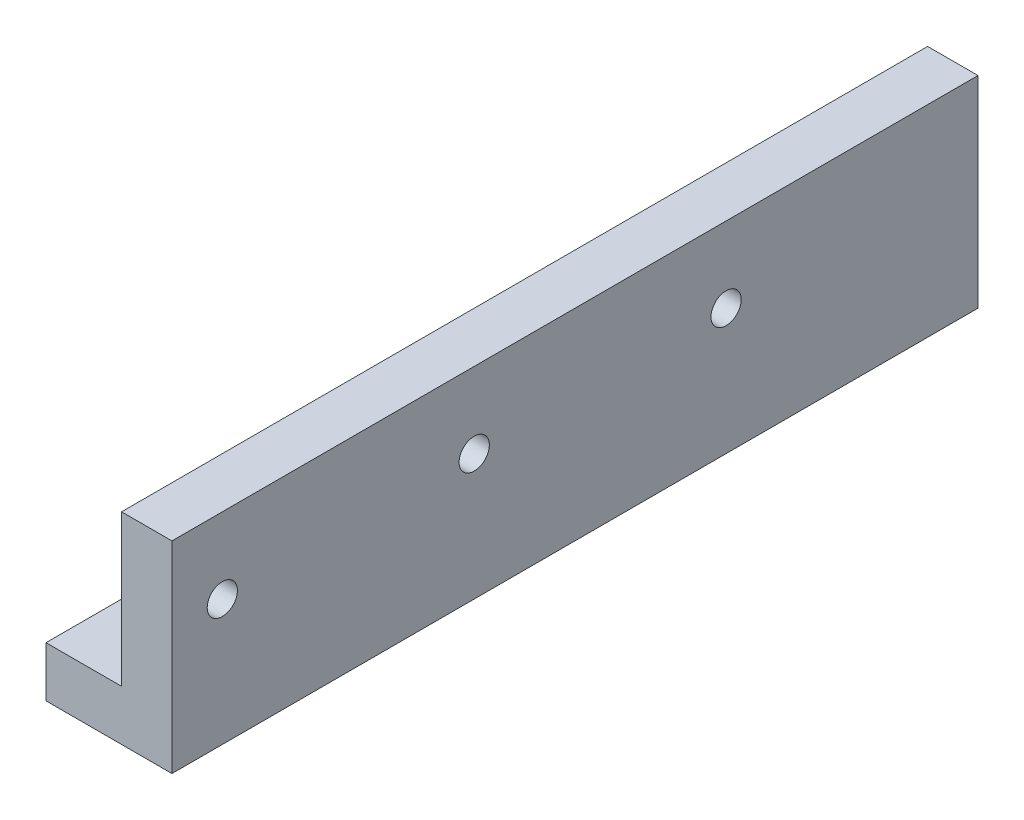
ISO-10303-21;
HEADER;
FILE_DESCRIPTION(('STEP AP214'),'2;1');
FILE_NAME('part.step','',(''),(''),'','','');
FILE_SCHEMA(('AUTOMOTIVE_DESIGN { 1 0 10303 214 1 1 1 1 }'));
ENDSEC;
DATA;
#1=APPLICATION_CONTEXT('core data for automotive mechanical design processes');
#2=APPLICATION_PROTOCOL_DEFINITION('international standard','automotive_design',2000,#1);
#3=PRODUCT_CONTEXT('',#1,'mechanical');
#4=PRODUCT('Part','Part','',(#3));
#5=PRODUCT_RELATED_PRODUCT_CATEGORY('part','',(#4));
#6=PRODUCT_DEFINITION_FORMATION('','',#4);
#7=PRODUCT_DEFINITION_CONTEXT('part definition',#1,'design');
#8=PRODUCT_DEFINITION('design','',#6,#7);
#9=PRODUCT_DEFINITION_SHAPE('','',#8);
#10=(LENGTH_UNIT() NAMED_UNIT(*) SI_UNIT(.MILLI.,.METRE.));
#11=(NAMED_UNIT(*) PLANE_ANGLE_UNIT() SI_UNIT($,.RADIAN.));
#12=(NAMED_UNIT(*) SI_UNIT($,.STERADIAN.) SOLID_ANGLE_UNIT());
#13=UNCERTAINTY_MEASURE_WITH_UNIT(LENGTH_MEASURE(1.E-05),#10,'distance_accuracy_value','');
#14=(GEOMETRIC_REPRESENTATION_CONTEXT(3) GLOBAL_UNCERTAINTY_ASSIGNED_CONTEXT((#13)) GLOBAL_UNIT_ASSIGNED_CONTEXT((#10,
#11,#12)) REPRESENTATION_CONTEXT('',''));
#15=CARTESIAN_POINT('',(0.,0.,0.));
#16=DIRECTION('',(0.,0.,1.));
#17=DIRECTION('',(1.,0.,0.));
#18=AXIS2_PLACEMENT_3D('',#15,#16,#17);
#19=CARTESIAN_POINT('',(4.66146532370146,191.771570680271,-160.));
#20=DIRECTION('',(0.,1.,0.));
#21=DIRECTION('',(0.,0.,1.));
#22=AXIS2_PLACEMENT_3D('',#19,#20,#21);
#23=PLANE('',#22);
#24=DIRECTION('',(-1.,0.,0.));
#25=VECTOR('',#24,1.);
#26=CARTESIAN_POINT('',(4.66146532370146,191.771570680271,0.));
#27=LINE('',#26,#25);
#28=CARTESIAN_POINT('',(4.66146532370146,191.771570680271,0.));
#29=VERTEX_POINT('',#28);
#30=CARTESIAN_POINT('',(-5.33853467629854,191.771570680271,0.));
#31=VERTEX_POINT('',#30);
#32=EDGE_CURVE('E134',#29,#31,#27,.T.);
#33=ORIENTED_EDGE('',*,*,#32,.F.);
#34=DIRECTION('',(0.,0.,1.));
#35=VECTOR('',#34,1.);
#36=CARTESIAN_POINT('',(4.66146532370146,191.771570680271,-160.));
#37=LINE('',#36,#35);
#38=CARTESIAN_POINT('',(4.66146532370146,191.771570680271,-160.));
#39=VERTEX_POINT('',#38);
#40=EDGE_CURVE('E13',#39,#29,#37,.T.);
#41=ORIENTED_EDGE('',*,*,#40,.F.);
#42=DIRECTION('',(-1.,0.,0.));
#43=VECTOR('',#42,1.);
#44=CARTESIAN_POINT('',(4.66146532370146,191.771570680271,-160.));
#45=LINE('',#44,#43);
#46=CARTESIAN_POINT('',(-5.33853467629854,191.771570680271,-160.));
#47=VERTEX_POINT('',#46);
#48=EDGE_CURVE('E149',#39,#47,#45,.T.);
#49=ORIENTED_EDGE('',*,*,#48,.T.);
#50=DIRECTION('',(0.,0.,1.));
#51=VECTOR('',#50,1.);
#52=CARTESIAN_POINT('',(-5.33853467629854,191.771570680271,-160.));
#53=LINE('',#52,#51);
#54=EDGE_CURVE('E52',#47,#31,#53,.T.);
#55=ORIENTED_EDGE('',*,*,#54,.T.);
#56=EDGE_LOOP('',(#33,#41,#49,#55));
#57=FACE_BOUND('',#56,.T.);
#58=ADVANCED_FACE('F49',(#57),#23,.T.);
#59=CARTESIAN_POINT('',(4.66146532370146,151.771570680271,-160.));
#60=DIRECTION('',(1.,0.,0.));
#61=DIRECTION('',(0.,1.,0.));
#62=AXIS2_PLACEMENT_3D('',#59,#60,#61);
#63=PLANE('',#62);
#64=CARTESIAN_POINT('',(4.66146532370146,176.771570680271,-60.));
#65=DIRECTION('',(1.,0.,0.));
#66=DIRECTION('',(0.,1.,0.));
#67=AXIS2_PLACEMENT_3D('',#64,#65,#66);
#68=CIRCLE('',#67,2.99999999999999);
#69=CARTESIAN_POINT('',(4.66146532370146,179.771570680271,-60.));
#70=VERTEX_POINT('',#69);
#71=EDGE_CURVE('E193',#70,#70,#68,.T.);
#72=ORIENTED_EDGE('',*,*,#71,.F.);
#73=EDGE_LOOP('',(#72));
#74=FACE_BOUND('',#73,.T.);
#75=CARTESIAN_POINT('',(4.66146532370146,176.771570680271,-9.99999999999999));
#76=DIRECTION('',(1.,0.,0.));
#77=DIRECTION('',(0.,1.,0.));
#78=AXIS2_PLACEMENT_3D('',#75,#76,#77);
#79=CIRCLE('',#78,2.99999999999999);
#80=CARTESIAN_POINT('',(4.66146532370146,179.771570680271,-9.99999999999999));
#81=VERTEX_POINT('',#80);
#82=EDGE_CURVE('E198',#81,#81,#79,.T.);
#83=ORIENTED_EDGE('',*,*,#82,.F.);
#84=EDGE_LOOP('',(#83));
#85=FACE_BOUND('',#84,.T.);
#86=CARTESIAN_POINT('',(4.66146532370146,176.771570680271,-110.));
#87=DIRECTION('',(1.,0.,0.));
#88=DIRECTION('',(0.,1.,0.));
#89=AXIS2_PLACEMENT_3D('',#86,#87,#88);
#90=CIRCLE('',#89,2.99999999999999);
#91=CARTESIAN_POINT('',(4.66146532370146,179.771570680271,-110.));
#92=VERTEX_POINT('',#91);
#93=EDGE_CURVE('E138',#92,#92,#90,.T.);
#94=ORIENTED_EDGE('',*,*,#93,.F.);
#95=EDGE_LOOP('',(#94));
#96=FACE_BOUND('',#95,.T.);
#97=DIRECTION('',(0.,1.,0.));
#98=VECTOR('',#97,1.);
#99=CARTESIAN_POINT('',(4.66146532370146,151.771570680271,0.));
#100=LINE('',#99,#98);
#101=CARTESIAN_POINT('',(4.66146532370146,151.771570680271,0.));
#102=VERTEX_POINT('',#101);
#103=EDGE_CURVE('E147',#102,#29,#100,.T.);
#104=ORIENTED_EDGE('',*,*,#103,.F.);
#105=DIRECTION('',(0.,0.,1.));
#106=VECTOR('',#105,1.);
#107=CARTESIAN_POINT('',(4.66146532370146,151.771570680271,-160.));
#108=LINE('',#107,#106);
#109=CARTESIAN_POINT('',(4.66146532370146,151.771570680271,-160.));
#110=VERTEX_POINT('',#109);
#111=EDGE_CURVE('E58',#110,#102,#108,.T.);
#112=ORIENTED_EDGE('',*,*,#111,.F.);
#113=DIRECTION('',(0.,1.,0.));
#114=VECTOR('',#113,1.);
#115=CARTESIAN_POINT('',(4.66146532370146,151.771570680271,-160.));
#116=LINE('',#115,#114);
#117=EDGE_CURVE('E124',#110,#39,#116,.T.);
#118=ORIENTED_EDGE('',*,*,#117,.T.);
#119=ORIENTED_EDGE('',*,*,#40,.T.);
#120=EDGE_LOOP('',(#104,#112,#118,#119));
#121=FACE_BOUND('',#120,.T.);
#122=ADVANCED_FACE('F157',(#74,#85,#96,#121),#63,.T.);
#123=CARTESIAN_POINT('',(-20.3385346762985,151.771570680271,-160.));
#124=DIRECTION('',(0.,-1.,0.));
#125=DIRECTION('',(0.,0.,-1.));
#126=AXIS2_PLACEMENT_3D('',#123,#124,#125);
#127=PLANE('',#126);
#128=DIRECTION('',(1.,0.,0.));
#129=VECTOR('',#128,1.);
#130=CARTESIAN_POINT('',(-20.3385346762985,151.771570680271,0.));
#131=LINE('',#130,#129);
#132=CARTESIAN_POINT('',(-20.3385346762985,151.771570680271,0.));
#133=VERTEX_POINT('',#132);
#134=EDGE_CURVE('E111',#133,#102,#131,.T.);
#135=ORIENTED_EDGE('',*,*,#134,.F.);
#136=DIRECTION('',(0.,0.,1.));
#137=VECTOR('',#136,1.);
#138=CARTESIAN_POINT('',(-20.3385346762985,151.771570680271,-160.));
#139=LINE('',#138,#137);
#140=CARTESIAN_POINT('',(-20.3385346762985,151.771570680271,-160.));
#141=VERTEX_POINT('',#140);
#142=EDGE_CURVE('E106',#141,#133,#139,.T.);
#143=ORIENTED_EDGE('',*,*,#142,.F.);
#144=DIRECTION('',(1.,0.,0.));
#145=VECTOR('',#144,1.);
#146=CARTESIAN_POINT('',(-20.3385346762985,151.771570680271,-160.));
#147=LINE('',#146,#145);
#148=EDGE_CURVE('E109',#141,#110,#147,.T.);
#149=ORIENTED_EDGE('',*,*,#148,.T.);
#150=ORIENTED_EDGE('',*,*,#111,.T.);
#151=EDGE_LOOP('',(#135,#143,#149,#150));
#152=FACE_BOUND('',#151,.T.);
#153=ADVANCED_FACE('F108',(#152),#127,.T.);
#154=CARTESIAN_POINT('',(-20.3385346762985,161.771570680271,-160.));
#155=DIRECTION('',(-1.,0.,0.));
#156=DIRECTION('',(0.,-1.,0.));
#157=AXIS2_PLACEMENT_3D('',#154,#155,#156);
#158=PLANE('',#157);
#159=DIRECTION('',(0.,-1.,0.));
#160=VECTOR('',#159,1.);
#161=CARTESIAN_POINT('',(-20.3385346762985,161.771570680271,0.));
#162=LINE('',#161,#160);
#163=CARTESIAN_POINT('',(-20.3385346762985,161.771570680271,0.));
#164=VERTEX_POINT('',#163);
#165=EDGE_CURVE('E144',#164,#133,#162,.T.);
#166=ORIENTED_EDGE('',*,*,#165,.F.);
#167=DIRECTION('',(0.,0.,1.));
#168=VECTOR('',#167,1.);
#169=CARTESIAN_POINT('',(-20.3385346762985,161.771570680271,-160.));
#170=LINE('',#169,#168);
#171=CARTESIAN_POINT('',(-20.3385346762985,161.771570680271,-160.));
#172=VERTEX_POINT('',#171);
#173=EDGE_CURVE('E116',#172,#164,#170,.T.);
#174=ORIENTED_EDGE('',*,*,#173,.F.);
#175=DIRECTION('',(0.,-1.,0.));
#176=VECTOR('',#175,1.);
#177=CARTESIAN_POINT('',(-20.3385346762985,161.771570680271,-160.));
#178=LINE('',#177,#176);
#179=EDGE_CURVE('E122',#172,#141,#178,.T.);
#180=ORIENTED_EDGE('',*,*,#179,.T.);
#181=ORIENTED_EDGE('',*,*,#142,.T.);
#182=EDGE_LOOP('',(#166,#174,#180,#181));
#183=FACE_BOUND('',#182,.T.);
#184=ADVANCED_FACE('F126',(#183),#158,.T.);
#185=CARTESIAN_POINT('',(-5.33853467629854,161.771570680271,-160.));
#186=DIRECTION('',(0.,1.,0.));
#187=DIRECTION('',(0.,0.,1.));
#188=AXIS2_PLACEMENT_3D('',#185,#186,#187);
#189=PLANE('',#188);
#190=DIRECTION('',(-1.,0.,0.));
#191=VECTOR('',#190,1.);
#192=CARTESIAN_POINT('',(-5.33853467629854,161.771570680271,0.));
#193=LINE('',#192,#191);
#194=CARTESIAN_POINT('',(-5.33853467629854,161.771570680271,0.));
#195=VERTEX_POINT('',#194);
#196=EDGE_CURVE('E141',#195,#164,#193,.T.);
#197=ORIENTED_EDGE('',*,*,#196,.F.);
#198=DIRECTION('',(0.,0.,1.));
#199=VECTOR('',#198,1.);
#200=CARTESIAN_POINT('',(-5.33853467629854,161.771570680271,-160.));
#201=LINE('',#200,#199);
#202=CARTESIAN_POINT('',(-5.33853467629854,161.771570680271,-160.));
#203=VERTEX_POINT('',#202);
#204=EDGE_CURVE('E152',#203,#195,#201,.T.);
#205=ORIENTED_EDGE('',*,*,#204,.F.);
#206=DIRECTION('',(-1.,0.,0.));
#207=VECTOR('',#206,1.);
#208=CARTESIAN_POINT('',(-5.33853467629854,161.771570680271,-160.));
#209=LINE('',#208,#207);
#210=EDGE_CURVE('E127',#203,#172,#209,.T.);
#211=ORIENTED_EDGE('',*,*,#210,.T.);
#212=ORIENTED_EDGE('',*,*,#173,.T.);
#213=EDGE_LOOP('',(#197,#205,#211,#212));
#214=FACE_BOUND('',#213,.T.);
#215=ADVANCED_FACE('F173',(#214),#189,.T.);
#216=CARTESIAN_POINT('',(-5.33853467629854,191.771570680271,-160.));
#217=DIRECTION('',(-1.,0.,0.));
#218=DIRECTION('',(0.,-1.,0.));
#219=AXIS2_PLACEMENT_3D('',#216,#217,#218);
#220=PLANE('',#219);
#221=CARTESIAN_POINT('',(-5.33853467629854,176.771570680271,-60.));
#222=DIRECTION('',(-1.,0.,0.));
#223=DIRECTION('',(0.,-1.,0.));
#224=AXIS2_PLACEMENT_3D('',#221,#222,#223);
#225=CIRCLE('',#224,2.99999999999999);
#226=CARTESIAN_POINT('',(-5.33853467629854,173.771570680271,-60.));
#227=VERTEX_POINT('',#226);
#228=EDGE_CURVE('E184',#227,#227,#225,.F.);
#229=ORIENTED_EDGE('',*,*,#228,.T.);
#230=EDGE_LOOP('',(#229));
#231=FACE_BOUND('',#230,.T.);
#232=CARTESIAN_POINT('',(-5.33853467629854,176.771570680271,-9.99999999999999));
#233=DIRECTION('',(-1.,0.,0.));
#234=DIRECTION('',(0.,-1.,0.));
#235=AXIS2_PLACEMENT_3D('',#232,#233,#234);
#236=CIRCLE('',#235,2.99999999999999);
#237=CARTESIAN_POINT('',(-5.33853467629854,173.771570680271,-9.99999999999999));
#238=VERTEX_POINT('',#237);
#239=EDGE_CURVE('E188',#238,#238,#236,.F.);
#240=ORIENTED_EDGE('',*,*,#239,.T.);
#241=EDGE_LOOP('',(#240));
#242=FACE_BOUND('',#241,.T.);
#243=CARTESIAN_POINT('',(-5.33853467629854,176.771570680271,-110.));
#244=DIRECTION('',(-1.,0.,0.));
#245=DIRECTION('',(0.,-1.,0.));
#246=AXIS2_PLACEMENT_3D('',#243,#244,#245);
#247=CIRCLE('',#246,2.99999999999999);
#248=CARTESIAN_POINT('',(-5.33853467629854,173.771570680271,-110.));
#249=VERTEX_POINT('',#248);
#250=EDGE_CURVE('E191',#249,#249,#247,.F.);
#251=ORIENTED_EDGE('',*,*,#250,.T.);
#252=EDGE_LOOP('',(#251));
#253=FACE_BOUND('',#252,.T.);
#254=DIRECTION('',(0.,-1.,0.));
#255=VECTOR('',#254,1.);
#256=CARTESIAN_POINT('',(-5.33853467629854,191.771570680271,0.));
#257=LINE('',#256,#255);
#258=EDGE_CURVE('E137',#31,#195,#257,.T.);
#259=ORIENTED_EDGE('',*,*,#258,.F.);
#260=ORIENTED_EDGE('',*,*,#54,.F.);
#261=DIRECTION('',(0.,-1.,0.));
#262=VECTOR('',#261,1.);
#263=CARTESIAN_POINT('',(-5.33853467629854,191.771570680271,-160.));
#264=LINE('',#263,#262);
#265=EDGE_CURVE('E129',#47,#203,#264,.T.);
#266=ORIENTED_EDGE('',*,*,#265,.T.);
#267=ORIENTED_EDGE('',*,*,#204,.T.);
#268=EDGE_LOOP('',(#259,#260,#266,#267));
#269=FACE_BOUND('',#268,.T.);
#270=ADVANCED_FACE('F154',(#231,#242,#253,#269),#220,.T.);
#271=CARTESIAN_POINT('',(0.,0.,-160.));
#272=DIRECTION('',(0.,0.,1.));
#273=DIRECTION('',(1.,0.,0.));
#274=AXIS2_PLACEMENT_3D('',#271,#272,#273);
#275=PLANE('',#274);
#276=ORIENTED_EDGE('',*,*,#48,.F.);
#277=ORIENTED_EDGE('',*,*,#117,.F.);
#278=ORIENTED_EDGE('',*,*,#148,.F.);
#279=ORIENTED_EDGE('',*,*,#179,.F.);
#280=ORIENTED_EDGE('',*,*,#210,.F.);
#281=ORIENTED_EDGE('',*,*,#265,.F.);
#282=EDGE_LOOP('',(#276,#277,#278,#279,#280,#281));
#283=FACE_BOUND('',#282,.T.);
#284=ADVANCED_FACE('F120',(#283),#275,.F.);
#285=CARTESIAN_POINT('',(0.,0.,0.));
#286=DIRECTION('',(0.,0.,1.));
#287=DIRECTION('',(1.,0.,0.));
#288=AXIS2_PLACEMENT_3D('',#285,#286,#287);
#289=PLANE('',#288);
#290=ORIENTED_EDGE('',*,*,#32,.T.);
#291=ORIENTED_EDGE('',*,*,#258,.T.);
#292=ORIENTED_EDGE('',*,*,#196,.T.);
#293=ORIENTED_EDGE('',*,*,#165,.T.);
#294=ORIENTED_EDGE('',*,*,#134,.T.);
#295=ORIENTED_EDGE('',*,*,#103,.T.);
#296=EDGE_LOOP('',(#290,#291,#292,#293,#294,#295));
#297=FACE_BOUND('',#296,.T.);
#298=ADVANCED_FACE('F156',(#297),#289,.T.);
#299=CARTESIAN_POINT('',(-13.8238160505371,176.771570680271,-110.));
#300=DIRECTION('',(1.,0.,0.));
#301=DIRECTION('',(0.,1.,0.));
#302=AXIS2_PLACEMENT_3D('',#299,#300,#301);
#303=CYLINDRICAL_SURFACE('',#302,2.99999999999999);
#304=ORIENTED_EDGE('',*,*,#93,.T.);
#305=EDGE_LOOP('',(#304));
#306=FACE_BOUND('',#305,.T.);
#307=ORIENTED_EDGE('',*,*,#250,.F.);
#308=EDGE_LOOP('',(#307));
#309=FACE_BOUND('',#308,.T.);
#310=ADVANCED_FACE('F212',(#306,#309),#303,.F.);
#311=CARTESIAN_POINT('',(-13.8238160505371,176.771570680271,-9.99999999999999));
#312=DIRECTION('',(1.,0.,0.));
#313=DIRECTION('',(0.,1.,0.));
#314=AXIS2_PLACEMENT_3D('',#311,#312,#313);
#315=CYLINDRICAL_SURFACE('',#314,2.99999999999999);
#316=ORIENTED_EDGE('',*,*,#82,.T.);
#317=EDGE_LOOP('',(#316));
#318=FACE_BOUND('',#317,.T.);
#319=ORIENTED_EDGE('',*,*,#239,.F.);
#320=EDGE_LOOP('',(#319));
#321=FACE_BOUND('',#320,.T.);
#322=ADVANCED_FACE('F207',(#318,#321),#315,.F.);
#323=CARTESIAN_POINT('',(-13.8238160505371,176.771570680271,-60.));
#324=DIRECTION('',(1.,0.,0.));
#325=DIRECTION('',(0.,1.,0.));
#326=AXIS2_PLACEMENT_3D('',#323,#324,#325);
#327=CYLINDRICAL_SURFACE('',#326,2.99999999999999);
#328=ORIENTED_EDGE('',*,*,#71,.T.);
#329=EDGE_LOOP('',(#328));
#330=FACE_BOUND('',#329,.T.);
#331=ORIENTED_EDGE('',*,*,#228,.F.);
#332=EDGE_LOOP('',(#331));
#333=FACE_BOUND('',#332,.T.);
#334=ADVANCED_FACE('F219',(#330,#333),#327,.F.);
#335=CLOSED_SHELL('',(#58,#122,#153,#184,#215,#270,#284,#298,#310,#322,#334));
#336=MANIFOLD_SOLID_BREP('B2',#335);
#337=ADVANCED_BREP_SHAPE_REPRESENTATION('',(#18,#336),#14);
#338=SHAPE_DEFINITION_REPRESENTATION(#9,#337);
ENDSEC;
END-ISO-10303-21;
